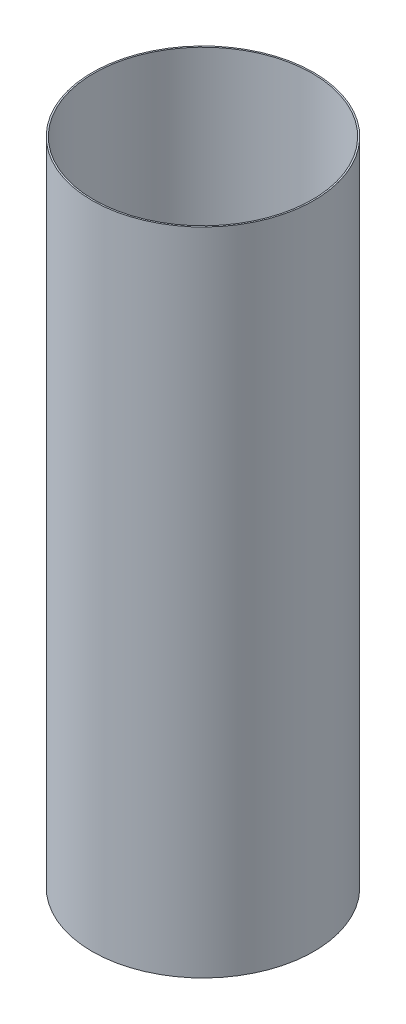
ISO-10303-21;
HEADER;
FILE_DESCRIPTION(('STEP AP214'),'2;1');
FILE_NAME('part.step','',(''),(''),'','','');
FILE_SCHEMA(('AUTOMOTIVE_DESIGN { 1 0 10303 214 1 1 1 1 }'));
ENDSEC;
DATA;
#1=APPLICATION_CONTEXT('core data for automotive mechanical design processes');
#2=APPLICATION_PROTOCOL_DEFINITION('international standard','automotive_design',2000,#1);
#3=PRODUCT_CONTEXT('',#1,'mechanical');
#4=PRODUCT('Part','Part','',(#3));
#5=PRODUCT_RELATED_PRODUCT_CATEGORY('part','',(#4));
#6=PRODUCT_DEFINITION_FORMATION('','',#4);
#7=PRODUCT_DEFINITION_CONTEXT('part definition',#1,'design');
#8=PRODUCT_DEFINITION('design','',#6,#7);
#9=PRODUCT_DEFINITION_SHAPE('','',#8);
#10=(LENGTH_UNIT() NAMED_UNIT(*) SI_UNIT(.MILLI.,.METRE.));
#11=(NAMED_UNIT(*) PLANE_ANGLE_UNIT() SI_UNIT($,.RADIAN.));
#12=(NAMED_UNIT(*) SI_UNIT($,.STERADIAN.) SOLID_ANGLE_UNIT());
#13=UNCERTAINTY_MEASURE_WITH_UNIT(LENGTH_MEASURE(1.E-05),#10,'distance_accuracy_value','');
#14=(GEOMETRIC_REPRESENTATION_CONTEXT(3) GLOBAL_UNCERTAINTY_ASSIGNED_CONTEXT((#13)) GLOBAL_UNIT_ASSIGNED_CONTEXT((#10,
#11,#12)) REPRESENTATION_CONTEXT('',''));
#15=CARTESIAN_POINT('',(0.,0.,0.));
#16=DIRECTION('',(0.,0.,1.));
#17=DIRECTION('',(1.,0.,0.));
#18=AXIS2_PLACEMENT_3D('',#15,#16,#17);
#19=CARTESIAN_POINT('',(0.,220.,0.));
#20=DIRECTION('',(0.,1.,0.));
#21=DIRECTION('',(0.,0.,1.));
#22=AXIS2_PLACEMENT_3D('',#19,#20,#21);
#23=PLANE('',#22);
#24=CARTESIAN_POINT('',(0.,220.,0.));
#25=DIRECTION('',(0.,1.,0.));
#26=DIRECTION('',(0.,0.,1.));
#27=AXIS2_PLACEMENT_3D('',#24,#25,#26);
#28=CIRCLE('',#27,37.5);
#29=CARTESIAN_POINT('',(0.,220.,37.5));
#30=VERTEX_POINT('',#29);
#31=EDGE_CURVE('E45',#30,#30,#28,.T.);
#32=ORIENTED_EDGE('',*,*,#31,.T.);
#33=EDGE_LOOP('',(#32));
#34=FACE_BOUND('',#33,.T.);
#35=CARTESIAN_POINT('',(0.,220.,0.));
#36=DIRECTION('',(0.,1.,0.));
#37=DIRECTION('',(0.,0.,1.));
#38=AXIS2_PLACEMENT_3D('',#35,#36,#37);
#39=CIRCLE('',#38,37.);
#40=CARTESIAN_POINT('',(0.,220.,37.));
#41=VERTEX_POINT('',#40);
#42=EDGE_CURVE('E56',#41,#41,#39,.T.);
#43=ORIENTED_EDGE('',*,*,#42,.F.);
#44=EDGE_LOOP('',(#43));
#45=FACE_BOUND('',#44,.T.);
#46=ADVANCED_FACE('F37',(#34,#45),#23,.T.);
#47=CARTESIAN_POINT('',(0.,0.,0.));
#48=DIRECTION('',(0.,1.,0.));
#49=DIRECTION('',(0.,0.,1.));
#50=AXIS2_PLACEMENT_3D('',#47,#48,#49);
#51=PLANE('',#50);
#52=CARTESIAN_POINT('',(0.,0.,0.));
#53=DIRECTION('',(0.,1.,0.));
#54=DIRECTION('',(0.,0.,1.));
#55=AXIS2_PLACEMENT_3D('',#52,#53,#54);
#56=CIRCLE('',#55,37.5);
#57=CARTESIAN_POINT('',(0.,0.,37.5));
#58=VERTEX_POINT('',#57);
#59=EDGE_CURVE('E50',#58,#58,#56,.T.);
#60=ORIENTED_EDGE('',*,*,#59,.F.);
#61=EDGE_LOOP('',(#60));
#62=FACE_BOUND('',#61,.T.);
#63=ADVANCED_FACE('F65',(#62),#51,.F.);
#64=CARTESIAN_POINT('',(0.,220.,0.));
#65=DIRECTION('',(0.,-1.,0.));
#66=DIRECTION('',(0.,0.,-1.));
#67=AXIS2_PLACEMENT_3D('',#64,#65,#66);
#68=CYLINDRICAL_SURFACE('',#67,37.5);
#69=ORIENTED_EDGE('',*,*,#31,.F.);
#70=EDGE_LOOP('',(#69));
#71=FACE_BOUND('',#70,.T.);
#72=ORIENTED_EDGE('',*,*,#59,.T.);
#73=EDGE_LOOP('',(#72));
#74=FACE_BOUND('',#73,.T.);
#75=ADVANCED_FACE('F39',(#71,#74),#68,.T.);
#76=CARTESIAN_POINT('',(0.,220.,0.));
#77=DIRECTION('',(0.,-1.,0.));
#78=DIRECTION('',(0.,0.,-1.));
#79=AXIS2_PLACEMENT_3D('',#76,#77,#78);
#80=CYLINDRICAL_SURFACE('',#79,37.);
#81=CARTESIAN_POINT('',(0.,1.,0.));
#82=DIRECTION('',(0.,1.,0.));
#83=DIRECTION('',(0.,0.,1.));
#84=AXIS2_PLACEMENT_3D('',#81,#82,#83);
#85=CIRCLE('',#84,37.);
#86=CARTESIAN_POINT('',(0.,1.,37.));
#87=VERTEX_POINT('',#86);
#88=EDGE_CURVE('E10',#87,#87,#85,.T.);
#89=ORIENTED_EDGE('',*,*,#88,.F.);
#90=EDGE_LOOP('',(#89));
#91=FACE_BOUND('',#90,.T.);
#92=ORIENTED_EDGE('',*,*,#42,.T.);
#93=EDGE_LOOP('',(#92));
#94=FACE_BOUND('',#93,.T.);
#95=ADVANCED_FACE('F62',(#91,#94),#80,.F.);
#96=CARTESIAN_POINT('',(0.,1.,0.));
#97=DIRECTION('',(0.,1.,0.));
#98=DIRECTION('',(0.,0.,1.));
#99=AXIS2_PLACEMENT_3D('',#96,#97,#98);
#100=PLANE('',#99);
#101=ORIENTED_EDGE('',*,*,#88,.T.);
#102=EDGE_LOOP('',(#101));
#103=FACE_BOUND('',#102,.T.);
#104=ADVANCED_FACE('F74',(#103),#100,.T.);
#105=CLOSED_SHELL('',(#46,#63,#75,#95,#104));
#106=MANIFOLD_SOLID_BREP('B2',#105);
#107=ADVANCED_BREP_SHAPE_REPRESENTATION('',(#18,#106),#14);
#108=SHAPE_DEFINITION_REPRESENTATION(#9,#107);
ENDSEC;
END-ISO-10303-21;
